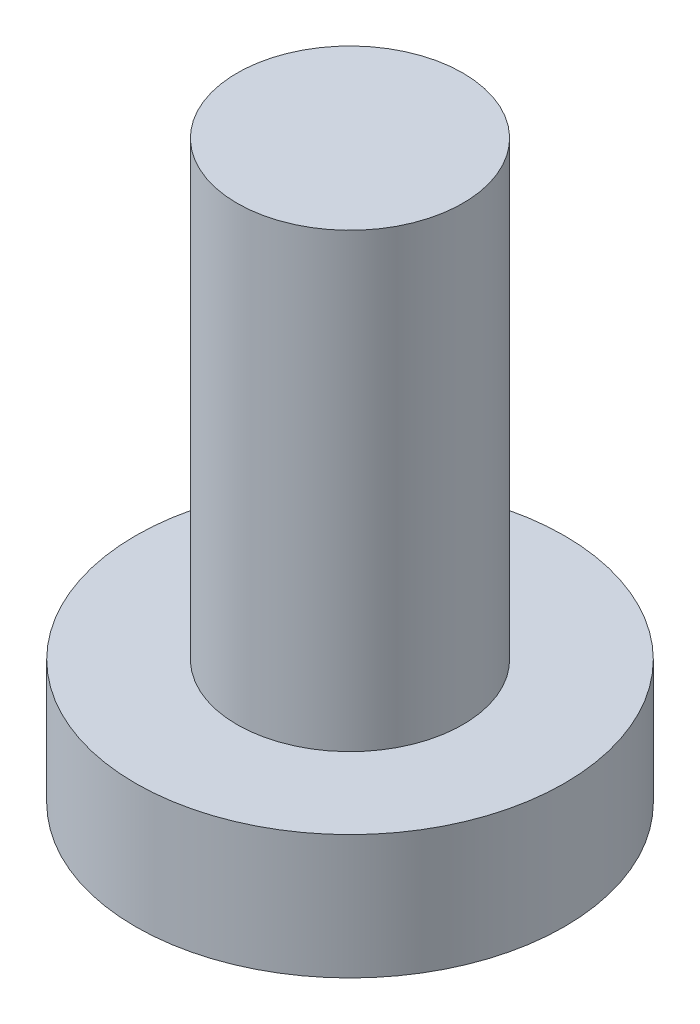
ISO-10303-21;
HEADER;
FILE_DESCRIPTION(('STEP AP214'),'2;1');
FILE_NAME('part.step','',(''),(''),'','','');
FILE_SCHEMA(('AUTOMOTIVE_DESIGN { 1 0 10303 214 1 1 1 1 }'));
ENDSEC;
DATA;
#1=APPLICATION_CONTEXT('core data for automotive mechanical design processes');
#2=APPLICATION_PROTOCOL_DEFINITION('international standard','automotive_design',2000,#1);
#3=PRODUCT_CONTEXT('',#1,'mechanical');
#4=PRODUCT('Part','Part','',(#3));
#5=PRODUCT_RELATED_PRODUCT_CATEGORY('part','',(#4));
#6=PRODUCT_DEFINITION_FORMATION('','',#4);
#7=PRODUCT_DEFINITION_CONTEXT('part definition',#1,'design');
#8=PRODUCT_DEFINITION('design','',#6,#7);
#9=PRODUCT_DEFINITION_SHAPE('','',#8);
#10=(LENGTH_UNIT() NAMED_UNIT(*) SI_UNIT(.MILLI.,.METRE.));
#11=(NAMED_UNIT(*) PLANE_ANGLE_UNIT() SI_UNIT($,.RADIAN.));
#12=(NAMED_UNIT(*) SI_UNIT($,.STERADIAN.) SOLID_ANGLE_UNIT());
#13=UNCERTAINTY_MEASURE_WITH_UNIT(LENGTH_MEASURE(1.E-05),#10,'distance_accuracy_value','');
#14=(GEOMETRIC_REPRESENTATION_CONTEXT(3) GLOBAL_UNCERTAINTY_ASSIGNED_CONTEXT((#13)) GLOBAL_UNIT_ASSIGNED_CONTEXT((#10,
#11,#12)) REPRESENTATION_CONTEXT('',''));
#15=CARTESIAN_POINT('',(0.,0.,0.));
#16=DIRECTION('',(0.,0.,1.));
#17=DIRECTION('',(1.,0.,0.));
#18=AXIS2_PLACEMENT_3D('',#15,#16,#17);
#19=CARTESIAN_POINT('',(0.,1.65,0.));
#20=DIRECTION('',(0.,-1.,0.));
#21=DIRECTION('',(0.,0.,-1.));
#22=AXIS2_PLACEMENT_3D('',#19,#20,#21);
#23=CYLINDRICAL_SURFACE('',#22,2.85);
#24=CARTESIAN_POINT('',(0.,1.65,0.));
#25=DIRECTION('',(0.,1.,0.));
#26=DIRECTION('',(0.,0.,1.));
#27=AXIS2_PLACEMENT_3D('',#24,#25,#26);
#28=CIRCLE('',#27,2.85);
#29=CARTESIAN_POINT('',(0.,1.65,2.85));
#30=VERTEX_POINT('',#29);
#31=EDGE_CURVE('E10',#30,#30,#28,.T.);
#32=ORIENTED_EDGE('',*,*,#31,.F.);
#33=EDGE_LOOP('',(#32));
#34=FACE_BOUND('',#33,.T.);
#35=CARTESIAN_POINT('',(0.,0.,0.));
#36=DIRECTION('',(0.,1.,0.));
#37=DIRECTION('',(0.,0.,1.));
#38=AXIS2_PLACEMENT_3D('',#35,#36,#37);
#39=CIRCLE('',#38,2.85);
#40=CARTESIAN_POINT('',(0.,0.,2.85));
#41=VERTEX_POINT('',#40);
#42=EDGE_CURVE('E35',#41,#41,#39,.T.);
#43=ORIENTED_EDGE('',*,*,#42,.T.);
#44=EDGE_LOOP('',(#43));
#45=FACE_BOUND('',#44,.T.);
#46=ADVANCED_FACE('F32',(#34,#45),#23,.T.);
#47=CARTESIAN_POINT('',(0.,1.65,0.));
#48=DIRECTION('',(0.,1.,0.));
#49=DIRECTION('',(0.,0.,1.));
#50=AXIS2_PLACEMENT_3D('',#47,#48,#49);
#51=PLANE('',#50);
#52=CARTESIAN_POINT('',(0.,1.65,0.));
#53=DIRECTION('',(0.,1.,0.));
#54=DIRECTION('',(0.,0.,1.));
#55=AXIS2_PLACEMENT_3D('',#52,#53,#54);
#56=CIRCLE('',#55,1.5);
#57=CARTESIAN_POINT('',(0.,1.65,1.5));
#58=VERTEX_POINT('',#57);
#59=EDGE_CURVE('E44',#58,#58,#56,.T.);
#60=ORIENTED_EDGE('',*,*,#59,.F.);
#61=EDGE_LOOP('',(#60));
#62=FACE_BOUND('',#61,.T.);
#63=ORIENTED_EDGE('',*,*,#31,.T.);
#64=EDGE_LOOP('',(#63));
#65=FACE_BOUND('',#64,.T.);
#66=ADVANCED_FACE('F59',(#62,#65),#51,.T.);
#67=CARTESIAN_POINT('',(0.,0.,0.));
#68=DIRECTION('',(0.,1.,0.));
#69=DIRECTION('',(0.,0.,1.));
#70=AXIS2_PLACEMENT_3D('',#67,#68,#69);
#71=PLANE('',#70);
#72=ORIENTED_EDGE('',*,*,#42,.F.);
#73=EDGE_LOOP('',(#72));
#74=FACE_BOUND('',#73,.T.);
#75=ADVANCED_FACE('F55',(#74),#71,.F.);
#76=CARTESIAN_POINT('',(0.,7.65,0.));
#77=DIRECTION('',(0.,-1.,0.));
#78=DIRECTION('',(0.,0.,-1.));
#79=AXIS2_PLACEMENT_3D('',#76,#77,#78);
#80=CYLINDRICAL_SURFACE('',#79,1.5);
#81=CARTESIAN_POINT('',(0.,7.65,0.));
#82=DIRECTION('',(0.,1.,0.));
#83=DIRECTION('',(0.,0.,1.));
#84=AXIS2_PLACEMENT_3D('',#81,#82,#83);
#85=CIRCLE('',#84,1.5);
#86=CARTESIAN_POINT('',(0.,7.65,1.5));
#87=VERTEX_POINT('',#86);
#88=EDGE_CURVE('E42',#87,#87,#85,.T.);
#89=ORIENTED_EDGE('',*,*,#88,.F.);
#90=EDGE_LOOP('',(#89));
#91=FACE_BOUND('',#90,.T.);
#92=ORIENTED_EDGE('',*,*,#59,.T.);
#93=EDGE_LOOP('',(#92));
#94=FACE_BOUND('',#93,.T.);
#95=ADVANCED_FACE('F52',(#91,#94),#80,.T.);
#96=CARTESIAN_POINT('',(0.,7.65,0.));
#97=DIRECTION('',(0.,1.,0.));
#98=DIRECTION('',(0.,0.,1.));
#99=AXIS2_PLACEMENT_3D('',#96,#97,#98);
#100=PLANE('',#99);
#101=ORIENTED_EDGE('',*,*,#88,.T.);
#102=EDGE_LOOP('',(#101));
#103=FACE_BOUND('',#102,.T.);
#104=ADVANCED_FACE('F50',(#103),#100,.T.);
#105=CLOSED_SHELL('',(#46,#66,#75,#95,#104));
#106=MANIFOLD_SOLID_BREP('B2',#105);
#107=ADVANCED_BREP_SHAPE_REPRESENTATION('',(#18,#106),#14);
#108=SHAPE_DEFINITION_REPRESENTATION(#9,#107);
ENDSEC;
END-ISO-10303-21;
